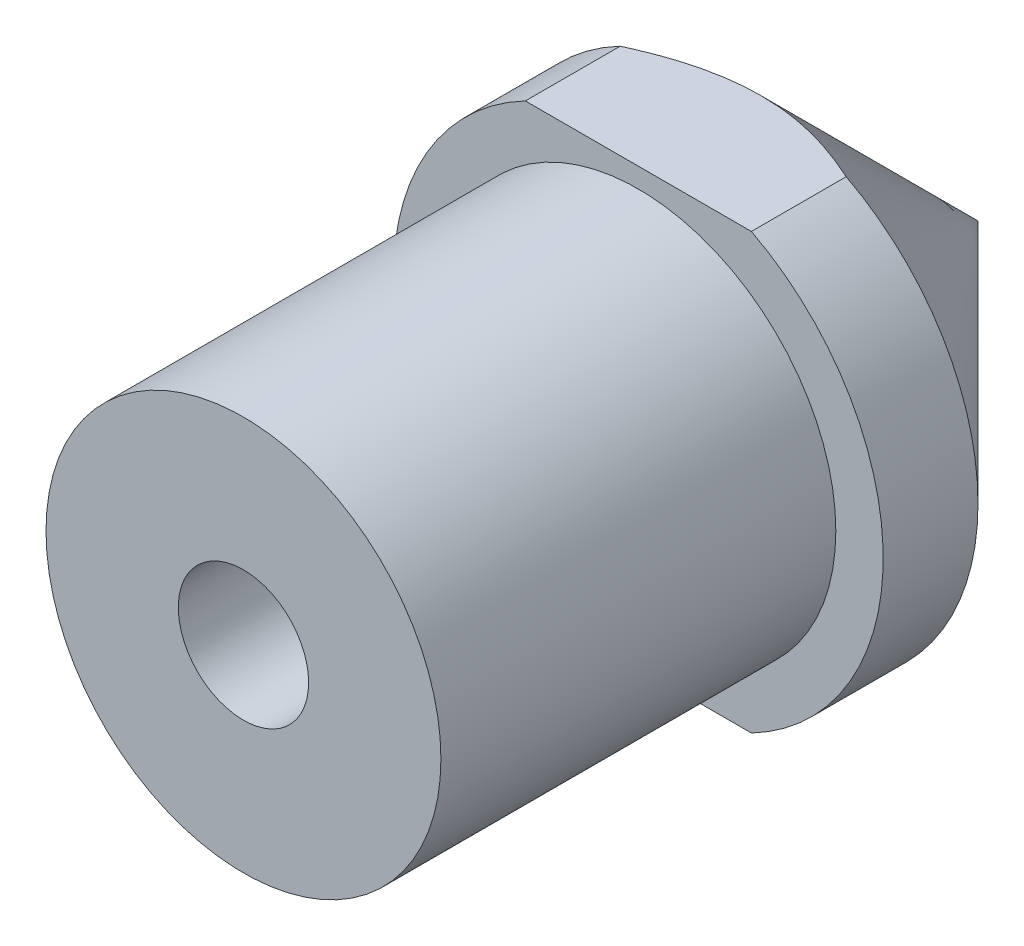
ISO-10303-21;
HEADER;
FILE_DESCRIPTION(('STEP AP214'),'2;1');
FILE_NAME('part.step','',(''),(''),'','','');
FILE_SCHEMA(('AUTOMOTIVE_DESIGN { 1 0 10303 214 1 1 1 1 }'));
ENDSEC;
DATA;
#1=APPLICATION_CONTEXT('core data for automotive mechanical design processes');
#2=APPLICATION_PROTOCOL_DEFINITION('international standard','automotive_design',2000,#1);
#3=PRODUCT_CONTEXT('',#1,'mechanical');
#4=PRODUCT('Part','Part','',(#3));
#5=PRODUCT_RELATED_PRODUCT_CATEGORY('part','',(#4));
#6=PRODUCT_DEFINITION_FORMATION('','',#4);
#7=PRODUCT_DEFINITION_CONTEXT('part definition',#1,'design');
#8=PRODUCT_DEFINITION('design','',#6,#7);
#9=PRODUCT_DEFINITION_SHAPE('','',#8);
#10=(LENGTH_UNIT() NAMED_UNIT(*) SI_UNIT(.MILLI.,.METRE.));
#11=(NAMED_UNIT(*) PLANE_ANGLE_UNIT() SI_UNIT($,.RADIAN.));
#12=(NAMED_UNIT(*) SI_UNIT($,.STERADIAN.) SOLID_ANGLE_UNIT());
#13=UNCERTAINTY_MEASURE_WITH_UNIT(LENGTH_MEASURE(1.E-05),#10,'distance_accuracy_value','');
#14=(GEOMETRIC_REPRESENTATION_CONTEXT(3) GLOBAL_UNCERTAINTY_ASSIGNED_CONTEXT((#13)) GLOBAL_UNIT_ASSIGNED_CONTEXT((#10,
#11,#12)) REPRESENTATION_CONTEXT('',''));
#15=CARTESIAN_POINT('',(0.,0.,0.));
#16=DIRECTION('',(0.,0.,1.));
#17=DIRECTION('',(1.,0.,0.));
#18=AXIS2_PLACEMENT_3D('',#15,#16,#17);
#19=CARTESIAN_POINT('',(-22.6644268247079,-3.70260438225425,10.));
#20=DIRECTION('',(0.,0.,-1.));
#21=DIRECTION('',(-1.,0.,0.));
#22=AXIS2_PLACEMENT_3D('',#19,#20,#21);
#23=CYLINDRICAL_SURFACE('',#22,5.);
#24=CARTESIAN_POINT('',(-22.6644268247079,-3.70260438225425,10.));
#25=DIRECTION('',(0.,0.,1.));
#26=DIRECTION('',(1.,0.,0.));
#27=AXIS2_PLACEMENT_3D('',#24,#25,#26);
#28=CIRCLE('',#27,5.);
#29=CARTESIAN_POINT('',(-17.6644268247079,-3.70260438225425,10.));
#30=VERTEX_POINT('',#29);
#31=EDGE_CURVE('E109',#30,#30,#28,.T.);
#32=ORIENTED_EDGE('',*,*,#31,.F.);
#33=EDGE_LOOP('',(#32));
#34=FACE_BOUND('',#33,.T.);
#35=CARTESIAN_POINT('',(-22.6644268247079,-3.70260438225425,0.));
#36=DIRECTION('',(0.,0.,-1.));
#37=DIRECTION('',(-1.,0.,0.));
#38=AXIS2_PLACEMENT_3D('',#35,#36,#37);
#39=CIRCLE('',#38,5.);
#40=CARTESIAN_POINT('',(-27.6644268247079,-3.70260438225425,0.));
#41=VERTEX_POINT('',#40);
#42=EDGE_CURVE('E106',#41,#41,#39,.T.);
#43=ORIENTED_EDGE('',*,*,#42,.F.);
#44=EDGE_LOOP('',(#43));
#45=FACE_BOUND('',#44,.T.);
#46=ADVANCED_FACE('F38',(#34,#45),#23,.T.);
#47=CARTESIAN_POINT('',(-22.6644268247079,-3.70260438225425,10.));
#48=DIRECTION('',(0.,0.,1.));
#49=DIRECTION('',(1.,0.,0.));
#50=AXIS2_PLACEMENT_3D('',#47,#48,#49);
#51=PLANE('',#50);
#52=CARTESIAN_POINT('',(-22.6644268247079,-3.70260438225425,10.));
#53=DIRECTION('',(0.,0.,1.));
#54=DIRECTION('',(1.,0.,0.));
#55=AXIS2_PLACEMENT_3D('',#52,#53,#54);
#56=CIRCLE('',#55,1.65);
#57=CARTESIAN_POINT('',(-21.0144268247079,-3.70260438225425,10.));
#58=VERTEX_POINT('',#57);
#59=EDGE_CURVE('E188',#58,#58,#56,.T.);
#60=ORIENTED_EDGE('',*,*,#59,.F.);
#61=EDGE_LOOP('',(#60));
#62=FACE_BOUND('',#61,.T.);
#63=ORIENTED_EDGE('',*,*,#31,.T.);
#64=EDGE_LOOP('',(#63));
#65=FACE_BOUND('',#64,.T.);
#66=ADVANCED_FACE('F155',(#62,#65),#51,.T.);
#67=CARTESIAN_POINT('',(-22.6644268247079,-3.70260438225425,0.));
#68=DIRECTION('',(0.,0.,-1.));
#69=DIRECTION('',(-1.,0.,0.));
#70=AXIS2_PLACEMENT_3D('',#67,#68,#69);
#71=PLANE('',#70);
#72=DIRECTION('',(1.,0.,0.));
#73=VECTOR('',#72,1.);
#74=CARTESIAN_POINT('',(-25.5262444289587,-9.20260438225425,0.));
#75=LINE('',#74,#73);
#76=CARTESIAN_POINT('',(-25.5262444289587,-9.20260438225425,0.));
#77=VERTEX_POINT('',#76);
#78=CARTESIAN_POINT('',(-19.802609220457,-9.20260438225425,0.));
#79=VERTEX_POINT('',#78);
#80=EDGE_CURVE('E102',#77,#79,#75,.T.);
#81=ORIENTED_EDGE('',*,*,#80,.T.);
#82=CARTESIAN_POINT('',(-22.6644268247079,-3.70260438225425,0.));
#83=DIRECTION('',(0.,0.,-1.));
#84=DIRECTION('',(-1.,0.,0.));
#85=AXIS2_PLACEMENT_3D('',#82,#83,#84);
#86=CIRCLE('',#85,6.2);
#87=CARTESIAN_POINT('',(-19.802609220457,1.79739561774575,0.));
#88=VERTEX_POINT('',#87);
#89=EDGE_CURVE('E100',#88,#79,#86,.T.);
#90=ORIENTED_EDGE('',*,*,#89,.F.);
#91=DIRECTION('',(1.,0.,0.));
#92=VECTOR('',#91,1.);
#93=CARTESIAN_POINT('',(-25.5262444289587,1.79739561774575,0.));
#94=LINE('',#93,#92);
#95=CARTESIAN_POINT('',(-25.5262444289587,1.79739561774574,0.));
#96=VERTEX_POINT('',#95);
#97=EDGE_CURVE('E86',#96,#88,#94,.T.);
#98=ORIENTED_EDGE('',*,*,#97,.F.);
#99=CARTESIAN_POINT('',(-22.6644268247079,-3.70260438225425,0.));
#100=DIRECTION('',(0.,0.,-1.));
#101=DIRECTION('',(-1.,0.,0.));
#102=AXIS2_PLACEMENT_3D('',#99,#100,#101);
#103=CIRCLE('',#102,6.2);
#104=EDGE_CURVE('E74',#77,#96,#103,.T.);
#105=ORIENTED_EDGE('',*,*,#104,.F.);
#106=EDGE_LOOP('',(#81,#90,#98,#105));
#107=FACE_BOUND('',#106,.T.);
#108=ORIENTED_EDGE('',*,*,#42,.T.);
#109=EDGE_LOOP('',(#108));
#110=FACE_BOUND('',#109,.T.);
#111=ADVANCED_FACE('F97',(#107,#110),#71,.F.);
#112=CARTESIAN_POINT('',(-25.5262444289587,-9.20260438225425,-2.4));
#113=DIRECTION('',(0.,-1.,0.));
#114=DIRECTION('',(1.,0.,0.));
#115=AXIS2_PLACEMENT_3D('',#112,#113,#114);
#116=PLANE('',#115);
#117=ORIENTED_EDGE('',*,*,#80,.F.);
#118=DIRECTION('',(0.,0.,1.));
#119=VECTOR('',#118,1.);
#120=CARTESIAN_POINT('',(-25.5262444289587,-9.20260438225425,-2.4));
#121=LINE('',#120,#119);
#122=CARTESIAN_POINT('',(-25.5262444289587,-9.20260438225425,-2.4));
#123=VERTEX_POINT('',#122);
#124=EDGE_CURVE('E80',#123,#77,#121,.T.);
#125=ORIENTED_EDGE('',*,*,#124,.F.);
#126=CARTESIAN_POINT('',(-29.4646327516443,-9.20260438225425,0.14601627306635));
#127=CARTESIAN_POINT('',(-29.3009890800505,-9.20260438225425,0.0188083086763543));
#128=CARTESIAN_POINT('',(-29.1364836570909,-9.20260438225425,-0.10730814277675));
#129=CARTESIAN_POINT('',(-28.8053901557283,-9.20260438225425,-0.356853737877385));
#130=CARTESIAN_POINT('',(-28.6388016097503,-9.20260438225425,-0.480282260510735));
#131=CARTESIAN_POINT('',(-28.3019680946376,-9.20260438225425,-0.724824989348546));
#132=CARTESIAN_POINT('',(-28.1317048656431,-9.20260438225425,-0.84591412490174));
#133=CARTESIAN_POINT('',(-27.7883800554823,-9.20260438225425,-1.08404396788505));
#134=CARTESIAN_POINT('',(-27.6153186657761,-9.20260438225425,-1.2010849505983));
#135=CARTESIAN_POINT('',(-27.2541804384064,-9.20260438225425,-1.43787678204553));
#136=CARTESIAN_POINT('',(-27.0658757040043,-9.20260438225425,-1.55728178988626));
#137=CARTESIAN_POINT('',(-26.6848347477583,-9.20260438225425,-1.78892190749881));
#138=CARTESIAN_POINT('',(-26.492097763019,-9.20260438225425,-1.9011557701932));
#139=CARTESIAN_POINT('',(-26.1020990752822,-9.20260438225425,-2.11608232476945));
#140=CARTESIAN_POINT('',(-25.9048528939406,-9.20260438225425,-2.21880296174949));
#141=CARTESIAN_POINT('',(-25.5046773956032,-9.20260438225425,-2.41240121747637));
#142=CARTESIAN_POINT('',(-25.301750876937,-9.20260438225425,-2.50328454715154));
#143=CARTESIAN_POINT('',(-24.9120282619982,-9.20260438225425,-2.66084932913112));
#144=CARTESIAN_POINT('',(-24.7258674412668,-9.20260438225425,-2.72908622395515));
#145=CARTESIAN_POINT('',(-24.3486545978223,-9.20260438225425,-2.8506714525901));
#146=CARTESIAN_POINT('',(-24.1576022766792,-9.20260438225425,-2.90401887562166));
#147=CARTESIAN_POINT('',(-23.7751665097215,-9.20260438225425,-2.99198367415759));
#148=CARTESIAN_POINT('',(-23.583865376141,-9.20260438225425,-3.02695278587577));
#149=CARTESIAN_POINT('',(-23.1986960534666,-9.20260438225425,-3.07740544434473));
#150=CARTESIAN_POINT('',(-23.0048284670473,-9.20260438225425,-3.09289348655921));
#151=CARTESIAN_POINT('',(-22.625961799583,-9.20260438225425,-3.1029673653125));
#152=CARTESIAN_POINT('',(-22.4409886026239,-9.20260438225425,-3.09853049108915));
#153=CARTESIAN_POINT('',(-22.0724097049193,-9.20260438225425,-3.07128513098533));
#154=CARTESIAN_POINT('',(-21.8888041240953,-9.20260438225425,-3.04847505272247));
#155=CARTESIAN_POINT('',(-21.5211705643909,-9.20260438225425,-2.98541173959935));
#156=CARTESIAN_POINT('',(-21.3371975110711,-9.20260438225425,-2.94484387137195));
#157=CARTESIAN_POINT('',(-20.9733327407166,-9.20260438225425,-2.84856697520679));
#158=CARTESIAN_POINT('',(-20.7934408597149,-9.20260438225425,-2.79285855673417));
#159=CARTESIAN_POINT('',(-20.431092040238,-9.20260438225425,-2.66638321511483));
#160=CARTESIAN_POINT('',(-20.2488145742582,-9.20260438225425,-2.59510829400276));
#161=CARTESIAN_POINT('',(-19.8889298837464,-9.20260438225425,-2.44151986178337));
#162=CARTESIAN_POINT('',(-19.7113247735394,-9.20260438225425,-2.35920145268125));
#163=CARTESIAN_POINT('',(-19.359958860856,-9.20260438225425,-2.18547625760075));
#164=CARTESIAN_POINT('',(-19.1862118731345,-9.20260438225425,-2.09404175868517));
#165=CARTESIAN_POINT('',(-18.8426922330247,-9.20260438225425,-1.904092337897));
#166=CARTESIAN_POINT('',(-18.6729189831319,-9.20260438225425,-1.80557848968449));
#167=CARTESIAN_POINT('',(-18.3451109897194,-9.20260438225425,-1.60784304233394));
#168=CARTESIAN_POINT('',(-18.1869100462724,-9.20260438225425,-1.50889551421778));
#169=CARTESIAN_POINT('',(-17.8732267472642,-9.20260438225425,-1.30676883368451));
#170=CARTESIAN_POINT('',(-17.7177445955996,-9.20260438225425,-1.20358936581683));
#171=CARTESIAN_POINT('',(-17.4103879125008,-9.20260438225425,-0.994587032844257));
#172=CARTESIAN_POINT('',(-17.2584944886677,-9.20260438225425,-0.888791850686741));
#173=CARTESIAN_POINT('',(-16.9567943930249,-9.20260438225425,-0.674350352343423));
#174=CARTESIAN_POINT('',(-16.8069871573142,-9.20260438225425,-0.565704830444159));
#175=CARTESIAN_POINT('',(-16.6580556684801,-9.20260438225425,-0.455892039863077));
#176=B_SPLINE_CURVE_WITH_KNOTS('',3,(#126,#127,#128,#129,#130,#131,#132,#133,#134,#135,#136,
#137,#138,#139,#140,#141,#142,#143,#144,#145,#146,#147,#148,#149,#150,#151,#152,#153,#154,#155,
#156,#157,#158,#159,#160,#161,#162,#163,#164,#165,#166,#167,#168,#169,#170,#171,#172,#173,#174,
#175),.UNSPECIFIED.,.F.,.F.,(4,2,2,2,2,2,2,2,2,2,2,2,2,2,2,2,2,2,2,2,2,2,2,2,4),(0.,
0.621822821603356,1.24378781569595,1.87053195157105,2.49723338336086,3.16602052692294,
3.83492365921675,4.50179505056554,5.16834350748078,5.76265454636885,6.35700193091508,
6.93951699297425,7.52189760881997,8.07603384521305,8.63021811306211,9.19464616703252,
9.75905150397614,10.3457564704034,10.9327225171446,11.5215307511874,12.1102498737756,
12.6699597232881,13.2297113699042,13.784993833438,14.3401231698416),.UNSPECIFIED.);
#177=CARTESIAN_POINT('',(-19.802609220457,-9.20260438225425,-2.39999999999992));
#178=VERTEX_POINT('',#177);
#179=EDGE_CURVE('E11',#178,#123,#176,.F.);
#180=ORIENTED_EDGE('',*,*,#179,.F.);
#181=DIRECTION('',(0.,0.,1.));
#182=VECTOR('',#181,1.);
#183=CARTESIAN_POINT('',(-19.802609220457,-9.20260438225425,-2.4));
#184=LINE('',#183,#182);
#185=EDGE_CURVE('E117',#178,#79,#184,.T.);
#186=ORIENTED_EDGE('',*,*,#185,.T.);
#187=EDGE_LOOP('',(#117,#125,#180,#186));
#188=FACE_BOUND('',#187,.T.);
#189=ADVANCED_FACE('F166',(#188),#116,.T.);
#190=CARTESIAN_POINT('',(-22.6644268247079,-3.70260438225425,-2.4));
#191=DIRECTION('',(0.,0.,1.));
#192=DIRECTION('',(1.,0.,0.));
#193=AXIS2_PLACEMENT_3D('',#190,#191,#192);
#194=CYLINDRICAL_SURFACE('',#193,6.2);
#195=ORIENTED_EDGE('',*,*,#104,.T.);
#196=DIRECTION('',(0.,0.,1.));
#197=VECTOR('',#196,1.);
#198=CARTESIAN_POINT('',(-25.5262444289587,1.79739561774574,-2.4));
#199=LINE('',#198,#197);
#200=CARTESIAN_POINT('',(-25.5262444289587,1.79739561774574,-2.39999999999992));
#201=VERTEX_POINT('',#200);
#202=EDGE_CURVE('E79',#201,#96,#199,.T.);
#203=ORIENTED_EDGE('',*,*,#202,.F.);
#204=CARTESIAN_POINT('',(-22.6644268247079,-3.70260438225425,-2.4));
#205=DIRECTION('',(0.,0.,-1.));
#206=DIRECTION('',(-1.,0.,0.));
#207=AXIS2_PLACEMENT_3D('',#204,#205,#206);
#208=CIRCLE('',#207,6.2);
#209=EDGE_CURVE('E113',#123,#201,#208,.T.);
#210=ORIENTED_EDGE('',*,*,#209,.F.);
#211=ORIENTED_EDGE('',*,*,#124,.T.);
#212=EDGE_LOOP('',(#195,#203,#210,#211));
#213=FACE_BOUND('',#212,.T.);
#214=ADVANCED_FACE('F76',(#213),#194,.T.);
#215=CARTESIAN_POINT('',(-25.5262444289587,1.79739561774575,-2.4));
#216=DIRECTION('',(0.,-1.,0.));
#217=DIRECTION('',(0.,0.,-1.));
#218=AXIS2_PLACEMENT_3D('',#215,#216,#217);
#219=PLANE('',#218);
#220=ORIENTED_EDGE('',*,*,#97,.T.);
#221=DIRECTION('',(0.,0.,1.));
#222=VECTOR('',#221,1.);
#223=CARTESIAN_POINT('',(-19.802609220457,1.79739561774575,-2.4));
#224=LINE('',#223,#222);
#225=CARTESIAN_POINT('',(-19.8026092204571,1.79739561774574,-2.40000000000001));
#226=VERTEX_POINT('',#225);
#227=EDGE_CURVE('E94',#226,#88,#224,.T.);
#228=ORIENTED_EDGE('',*,*,#227,.F.);
#229=CARTESIAN_POINT('',(-28.0056357746964,1.79739561774574,-0.933285381114149));
#230=CARTESIAN_POINT('',(-27.8718908371763,1.79739561774574,-1.02644140151037));
#231=CARTESIAN_POINT('',(-27.7373104453685,1.79739561774574,-1.11841856483027));
#232=CARTESIAN_POINT('',(-27.4661993037397,1.79739561774574,-1.29953715764606));
#233=CARTESIAN_POINT('',(-27.3296679862099,1.79739561774574,-1.38867773631562));
#234=CARTESIAN_POINT('',(-27.0534502845644,1.79739561774574,-1.56422755940002));
#235=CARTESIAN_POINT('',(-26.9137481447478,1.79739561774574,-1.6506121166176));
#236=CARTESIAN_POINT('',(-26.631902880319,1.79739561774574,-1.81928376464169));
#237=CARTESIAN_POINT('',(-26.4897599505645,1.79739561774574,-1.90157118051212));
#238=CARTESIAN_POINT('',(-26.1977554955294,1.79739561774574,-2.06400830008676));
#239=CARTESIAN_POINT('',(-26.0477970638796,1.79739561774574,-2.14398556767809));
#240=CARTESIAN_POINT('',(-25.7446553445194,1.79739561774574,-2.29756198248511));
#241=CARTESIAN_POINT('',(-25.5914715714784,1.79739561774574,-2.37116016116346));
#242=CARTESIAN_POINT('',(-25.1275184772844,1.79739561774574,-2.57997685447206));
#243=CARTESIAN_POINT('',(-24.8112966278113,1.79739561774574,-2.70382263016494));
#244=CARTESIAN_POINT('',(-24.3508640522367,1.79739561774574,-2.8487291797321));
#245=CARTESIAN_POINT('',(-24.2122915880304,1.79739561774574,-2.88794610051493));
#246=CARTESIAN_POINT('',(-23.9328276296419,1.79739561774574,-2.95725968086831));
#247=CARTESIAN_POINT('',(-23.7919358179214,1.79739561774574,-2.98735508049111));
#248=CARTESIAN_POINT('',(-23.5099392432112,1.79739561774574,-3.0370997099758));
#249=CARTESIAN_POINT('',(-23.3688547362501,1.79739561774574,-3.05686273316292));
#250=CARTESIAN_POINT('',(-23.08559824531,1.79739561774574,-3.08569751540503));
#251=CARTESIAN_POINT('',(-22.9434263247149,1.79739561774574,-3.09476989289355));
#252=CARTESIAN_POINT('',(-22.6293978070374,1.79739561774574,-3.10256339276089));
#253=CARTESIAN_POINT('',(-22.4574720340408,1.79739561774574,-3.09876099879058));
#254=CARTESIAN_POINT('',(-22.1147077522781,1.79739561774574,-3.07524447362299));
#255=CARTESIAN_POINT('',(-21.9438694672183,1.79739561774574,-3.05552716881367));
#256=CARTESIAN_POINT('',(-21.602226022574,1.79739561774574,-3.0009446341753));
#257=CARTESIAN_POINT('',(-21.431454277105,1.79739561774574,-2.9658728226693));
#258=CARTESIAN_POINT('',(-21.0933056623794,1.79739561774574,-2.88234575207861));
#259=CARTESIAN_POINT('',(-20.9259283845246,1.79739561774574,-2.83389211417668));
#260=CARTESIAN_POINT('',(-20.4171525336323,1.79739561774574,-2.66747622280582));
#261=CARTESIAN_POINT('',(-20.0818553794383,1.79739561774574,-2.53073964233348));
#262=CARTESIAN_POINT('',(-19.5904850478224,1.79739561774574,-2.30094327755866));
#263=CARTESIAN_POINT('',(-19.4283377441893,1.79739561774574,-2.22005824194267));
#264=CARTESIAN_POINT('',(-19.1075833532954,1.79739561774574,-2.05152605249154));
#265=CARTESIAN_POINT('',(-18.9489757981472,1.79739561774574,-1.96387979926808));
#266=CARTESIAN_POINT('',(-18.6410693250309,1.79739561774574,-1.78661715596386));
#267=CARTESIAN_POINT('',(-18.4916484322301,1.79739561774574,-1.69721039211091));
#268=CARTESIAN_POINT('',(-18.1953934168326,1.79739561774574,-1.51419027875272));
#269=CARTESIAN_POINT('',(-18.0485594971284,1.79739561774574,-1.4205766013319));
#270=CARTESIAN_POINT('',(-17.7582980089198,1.79739561774574,-1.2305949175487));
#271=CARTESIAN_POINT('',(-17.614852963773,1.79739561774574,-1.13425350059347));
#272=CARTESIAN_POINT('',(-17.3299939408652,1.79739561774574,-0.938698010013812));
#273=CARTESIAN_POINT('',(-17.1885793803337,1.79739561774574,-0.839484786322012));
#274=CARTESIAN_POINT('',(-17.0480259457877,1.79739561774574,-0.739086641316047));
#275=B_SPLINE_CURVE_WITH_KNOTS('',3,(#229,#230,#231,#232,#233,#234,#235,#236,#237,#238,#239,
#240,#241,#242,#243,#244,#245,#246,#247,#248,#249,#250,#251,#252,#253,#254,#255,#256,#257,#258,
#259,#260,#261,#262,#263,#264,#265,#266,#267,#268,#269,#270,#271,#272,#273,#274),.UNSPECIFIED.,
.F.,.F.,(4,2,2,2,2,2,2,2,2,2,2,2,2,2,2,2,2,2,2,2,2,2,4),(0.,0.48898102223468,0.978107356450499,
1.47080408922081,1.96346166933323,2.47316268980585,2.9829409631366,3.9988707016907,
4.43067366240617,4.86253624053348,5.28953670134461,5.71651245977819,6.2316319257489,
6.74685413771379,7.26923211922681,7.79154684338249,8.87464342777831,9.41818732412567,
9.96165894362322,10.4839672211763,11.0063162818591,11.5246643471826,12.0428605412267),.UNSPECIFIED.);
#276=EDGE_CURVE('E52',#201,#226,#275,.T.);
#277=ORIENTED_EDGE('',*,*,#276,.F.);
#278=ORIENTED_EDGE('',*,*,#202,.T.);
#279=EDGE_LOOP('',(#220,#228,#277,#278));
#280=FACE_BOUND('',#279,.T.);
#281=ADVANCED_FACE('F90',(#280),#219,.F.);
#282=CARTESIAN_POINT('',(-22.6644268247079,-3.70260438225425,-2.4));
#283=DIRECTION('',(0.,0.,1.));
#284=DIRECTION('',(1.,0.,0.));
#285=AXIS2_PLACEMENT_3D('',#282,#283,#284);
#286=CYLINDRICAL_SURFACE('',#285,6.2);
#287=ORIENTED_EDGE('',*,*,#89,.T.);
#288=ORIENTED_EDGE('',*,*,#185,.F.);
#289=CARTESIAN_POINT('',(-22.6644268247079,-3.70260438225425,-2.4));
#290=DIRECTION('',(0.,0.,-1.));
#291=DIRECTION('',(-1.,0.,0.));
#292=AXIS2_PLACEMENT_3D('',#289,#290,#291);
#293=CIRCLE('',#292,6.2);
#294=EDGE_CURVE('E85',#226,#178,#293,.T.);
#295=ORIENTED_EDGE('',*,*,#294,.F.);
#296=ORIENTED_EDGE('',*,*,#227,.T.);
#297=EDGE_LOOP('',(#287,#288,#295,#296));
#298=FACE_BOUND('',#297,.T.);
#299=ADVANCED_FACE('F177',(#298),#286,.T.);
#300=CARTESIAN_POINT('',(-22.6644268247078,-3.70260438225425,-8.60000000000006));
#301=DIRECTION('',(0.,0.,1.));
#302=DIRECTION('',(1.,0.,0.));
#303=AXIS2_PLACEMENT_3D('',#300,#301,#302);
#304=CONICAL_SURFACE('',#303,0.,0.785398163397443);
#305=ORIENTED_EDGE('',*,*,#294,.T.);
#306=ORIENTED_EDGE('',*,*,#179,.T.);
#307=ORIENTED_EDGE('',*,*,#209,.T.);
#308=ORIENTED_EDGE('',*,*,#276,.T.);
#309=EDGE_LOOP('',(#305,#306,#307,#308));
#310=FACE_BOUND('',#309,.T.);
#311=CARTESIAN_POINT('',(-22.6644268247078,-3.70260438225425,-8.60000000000006));
#312=VERTEX_POINT('',#311);
#313=VERTEX_LOOP('',#312);
#314=FACE_BOUND('',#313,.T.);
#315=ADVANCED_FACE('F137',(#310,#314),#304,.T.);
#316=CARTESIAN_POINT('',(-22.6644268247079,-3.70260438225425,-0.0999999999999994));
#317=DIRECTION('',(0.,0.,1.));
#318=DIRECTION('',(1.,0.,0.));
#319=AXIS2_PLACEMENT_3D('',#316,#317,#318);
#320=CONICAL_SURFACE('',#319,1.65,1.02974425867665);
#321=CARTESIAN_POINT('',(-22.6644268247079,-3.70260438225425,-1.09142002139547));
#322=VERTEX_POINT('',#321);
#323=VERTEX_LOOP('',#322);
#324=FACE_BOUND('',#323,.T.);
#325=CARTESIAN_POINT('',(-22.6644268247079,-3.70260438225425,-0.0999999999999994));
#326=DIRECTION('',(0.,0.,1.));
#327=DIRECTION('',(1.,0.,0.));
#328=AXIS2_PLACEMENT_3D('',#325,#326,#327);
#329=CIRCLE('',#328,1.65);
#330=CARTESIAN_POINT('',(-21.0144268247079,-3.70260438225425,-0.0999999999999994));
#331=VERTEX_POINT('',#330);
#332=EDGE_CURVE('E186',#331,#331,#329,.T.);
#333=ORIENTED_EDGE('',*,*,#332,.T.);
#334=EDGE_LOOP('',(#333));
#335=FACE_BOUND('',#334,.T.);
#336=ADVANCED_FACE('F143',(#324,#335),#320,.F.);
#337=CARTESIAN_POINT('',(-22.6644268247079,-3.70260438225425,10.));
#338=DIRECTION('',(0.,0.,1.));
#339=DIRECTION('',(1.,0.,0.));
#340=AXIS2_PLACEMENT_3D('',#337,#338,#339);
#341=CYLINDRICAL_SURFACE('',#340,1.65);
#342=ORIENTED_EDGE('',*,*,#332,.F.);
#343=EDGE_LOOP('',(#342));
#344=FACE_BOUND('',#343,.T.);
#345=ORIENTED_EDGE('',*,*,#59,.T.);
#346=EDGE_LOOP('',(#345));
#347=FACE_BOUND('',#346,.T.);
#348=ADVANCED_FACE('F146',(#344,#347),#341,.F.);
#349=CLOSED_SHELL('',(#46,#66,#111,#189,#214,#281,#299,#315,#336,#348));
#350=MANIFOLD_SOLID_BREP('B2',#349);
#351=ADVANCED_BREP_SHAPE_REPRESENTATION('',(#18,#350),#14);
#352=SHAPE_DEFINITION_REPRESENTATION(#9,#351);
ENDSEC;
END-ISO-10303-21;
